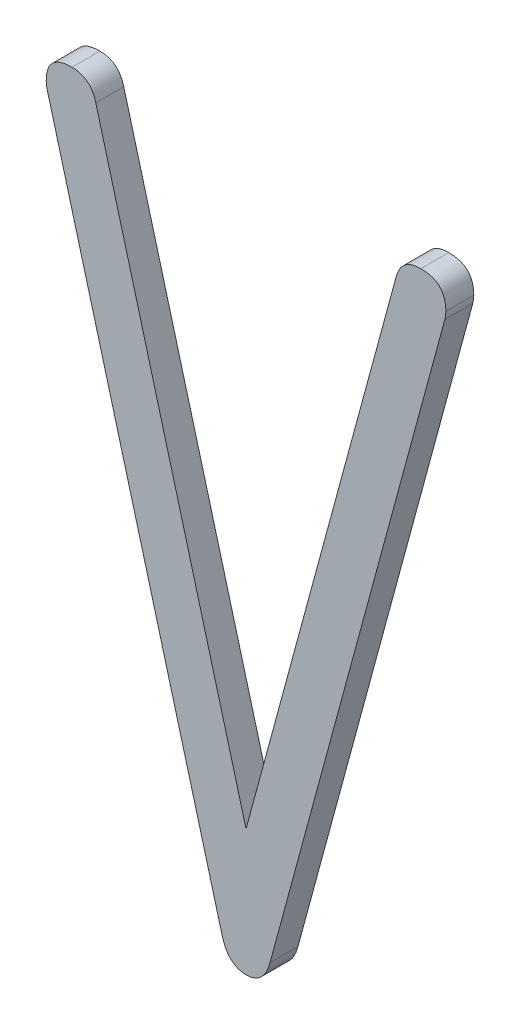
ISO-10303-21;
HEADER;
FILE_DESCRIPTION(('STEP AP214'),'2;1');
FILE_NAME('part.step','',(''),(''),'','','');
FILE_SCHEMA(('AUTOMOTIVE_DESIGN { 1 0 10303 214 1 1 1 1 }'));
ENDSEC;
DATA;
#1=APPLICATION_CONTEXT('core data for automotive mechanical design processes');
#2=APPLICATION_PROTOCOL_DEFINITION('international standard','automotive_design',2000,#1);
#3=PRODUCT_CONTEXT('',#1,'mechanical');
#4=PRODUCT('Part','Part','',(#3));
#5=PRODUCT_RELATED_PRODUCT_CATEGORY('part','',(#4));
#6=PRODUCT_DEFINITION_FORMATION('','',#4);
#7=PRODUCT_DEFINITION_CONTEXT('part definition',#1,'design');
#8=PRODUCT_DEFINITION('design','',#6,#7);
#9=PRODUCT_DEFINITION_SHAPE('','',#8);
#10=(LENGTH_UNIT() NAMED_UNIT(*) SI_UNIT(.MILLI.,.METRE.));
#11=(NAMED_UNIT(*) PLANE_ANGLE_UNIT() SI_UNIT($,.RADIAN.));
#12=(NAMED_UNIT(*) SI_UNIT($,.STERADIAN.) SOLID_ANGLE_UNIT());
#13=UNCERTAINTY_MEASURE_WITH_UNIT(LENGTH_MEASURE(1.E-05),#10,'distance_accuracy_value','');
#14=(GEOMETRIC_REPRESENTATION_CONTEXT(3) GLOBAL_UNCERTAINTY_ASSIGNED_CONTEXT((#13)) GLOBAL_UNIT_ASSIGNED_CONTEXT((#10,
#11,#12)) REPRESENTATION_CONTEXT('',''));
#15=CARTESIAN_POINT('',(0.,0.,0.));
#16=DIRECTION('',(0.,0.,1.));
#17=DIRECTION('',(1.,0.,0.));
#18=AXIS2_PLACEMENT_3D('',#15,#16,#17);
#19=CARTESIAN_POINT('',(0.,0.,1.6));
#20=DIRECTION('',(0.,0.,-1.));
#21=DIRECTION('',(-1.,0.,0.));
#22=AXIS2_PLACEMENT_3D('',#19,#20,#21);
#23=PLANE('',#22);
#24=CARTESIAN_POINT('',(10.4104312474728,-19.6608047798276,1.6));
#25=CARTESIAN_POINT('',(10.4104305589906,-19.6633076047553,1.6));
#26=CARTESIAN_POINT('',(10.4103281700194,-19.6658075865796,1.6));
#27=CARTESIAN_POINT('',(10.4099431319938,-19.6707934504474,1.6));
#28=CARTESIAN_POINT('',(10.4096605153006,-19.6732793349414,1.6));
#29=CARTESIAN_POINT('',(10.4086925987024,-19.6799121488722,1.6));
#30=CARTESIAN_POINT('',(10.4078641591437,-19.6840393939792,1.6));
#31=CARTESIAN_POINT('',(10.4068687474728,-19.6881172798276,1.6));
#32=B_SPLINE_CURVE_WITH_KNOTS('',3,(#24,#25,#26,#27,#28,#29,#30,#31),.UNSPECIFIED.,.F.,.F.,(4,2,
2,4),(0.,0.00750178916076674,0.0150022317003972,0.0276017619985489),.UNSPECIFIED.);
#33=CARTESIAN_POINT('',(10.4104312474728,-19.6608047798276,1.6));
#34=VERTEX_POINT('',#33);
#35=CARTESIAN_POINT('',(10.4068687474728,-19.6881172798276,1.6));
#36=VERTEX_POINT('',#35);
#37=EDGE_CURVE('E137',#34,#36,#32,.T.);
#38=ORIENTED_EDGE('',*,*,#37,.T.);
#39=DIRECTION('',(0.261841637735637,0.96511085205168,0.));
#40=VECTOR('',#39,1.);
#41=CARTESIAN_POINT('',(10.4068687474728,-19.6881172798276,1.6));
#42=LINE('',#41,#40);
#43=CARTESIAN_POINT('',(9.7815562474728,-21.9929297798276,1.6));
#44=VERTEX_POINT('',#43);
#45=EDGE_CURVE('E115',#44,#36,#42,.T.);
#46=ORIENTED_EDGE('',*,*,#45,.F.);
#47=CARTESIAN_POINT('',(9.7815562474728,-21.9929297798276,1.6));
#48=CARTESIAN_POINT('',(9.7601187474728,-22.0733047798276,1.6));
#49=CARTESIAN_POINT('',(9.6958062474728,-22.0733047798276,1.6));
#50=B_SPLINE_CURVE_WITH_KNOTS('',2,(#47,#48,#49),.UNSPECIFIED.,.F.,.F.,(3,3),(0.,1.),.UNSPECIFIED.);
#51=CARTESIAN_POINT('',(9.6958062474728,-22.0733047798276,1.6));
#52=VERTEX_POINT('',#51);
#53=EDGE_CURVE('E107',#44,#52,#50,.T.);
#54=ORIENTED_EDGE('',*,*,#53,.T.);
#55=CARTESIAN_POINT('',(9.6958062474728,-22.0733047798276,1.6));
#56=CARTESIAN_POINT('',(9.6314312474728,-22.0733047798276,1.6));
#57=CARTESIAN_POINT('',(9.6099937474728,-21.9929297798276,1.6));
#58=B_SPLINE_CURVE_WITH_KNOTS('',2,(#55,#56,#57),.UNSPECIFIED.,.F.,.F.,(3,3),(0.,1.),.UNSPECIFIED.);
#59=CARTESIAN_POINT('',(9.6099937474728,-21.9929297798276,1.6));
#60=VERTEX_POINT('',#59);
#61=EDGE_CURVE('E113',#52,#60,#58,.T.);
#62=ORIENTED_EDGE('',*,*,#61,.T.);
#63=DIRECTION('',(0.261841637735637,-0.96511085205168,0.));
#64=VECTOR('',#63,1.);
#65=CARTESIAN_POINT('',(9.6099937474728,-21.9929297798276,1.6));
#66=LINE('',#65,#64);
#67=CARTESIAN_POINT('',(8.9846812474728,-19.6881172798276,1.6));
#68=VERTEX_POINT('',#67);
#69=EDGE_CURVE('E123',#68,#60,#66,.T.);
#70=ORIENTED_EDGE('',*,*,#69,.F.);
#71=CARTESIAN_POINT('',(8.9846812474728,-19.6881172798276,1.6));
#72=CARTESIAN_POINT('',(8.98407767472837,-19.6856898823801,1.6));
#73=CARTESIAN_POINT('',(8.9835348476318,-19.683245485837,1.6));
#74=CARTESIAN_POINT('',(8.98259352797575,-19.6783289874013,1.6));
#75=CARTESIAN_POINT('',(8.9821950514327,-19.6758568824657,1.6));
#76=CARTESIAN_POINT('',(8.98135198276433,-19.6692086987752,1.6));
#77=CARTESIAN_POINT('',(8.98105928567588,-19.6650136732053,1.6));
#78=CARTESIAN_POINT('',(8.9810562474728,-19.6608047798298,1.6));
#79=B_SPLINE_CURVE_WITH_KNOTS('',3,(#71,#72,#73,#74,#75,#76,#77,#78),.UNSPECIFIED.,.F.,.F.,(4,2,
2,4),(0.,0.0075061529714251,0.0150131385333068,0.0276096797045703),.UNSPECIFIED.);
#80=CARTESIAN_POINT('',(8.9810562474728,-19.6608047798276,1.6));
#81=VERTEX_POINT('',#80);
#82=EDGE_CURVE('E23',#68,#81,#79,.T.);
#83=ORIENTED_EDGE('',*,*,#82,.T.);
#84=CARTESIAN_POINT('',(8.9810562474728,-19.6608047798276,1.6));
#85=CARTESIAN_POINT('',(8.9810562474728,-19.5733047798276,1.6));
#86=CARTESIAN_POINT('',(9.0730562474728,-19.5733047798276,1.6));
#87=B_SPLINE_CURVE_WITH_KNOTS('',2,(#84,#85,#86),.UNSPECIFIED.,.F.,.F.,(3,3),(0.,1.),.UNSPECIFIED.);
#88=CARTESIAN_POINT('',(9.0730562474728,-19.5733047798276,1.6));
#89=VERTEX_POINT('',#88);
#90=EDGE_CURVE('E159',#81,#89,#87,.T.);
#91=ORIENTED_EDGE('',*,*,#90,.T.);
#92=CARTESIAN_POINT('',(9.0730562474728,-19.5733047798276,1.6));
#93=CARTESIAN_POINT('',(9.1402437474728,-19.5733047798276,1.6));
#94=CARTESIAN_POINT('',(9.1584312474728,-19.6410547798276,1.6));
#95=B_SPLINE_CURVE_WITH_KNOTS('',2,(#92,#93,#94),.UNSPECIFIED.,.F.,.F.,(3,3),(0.,1.),.UNSPECIFIED.);
#96=CARTESIAN_POINT('',(9.1584312474728,-19.6410547798276,1.6));
#97=VERTEX_POINT('',#96);
#98=EDGE_CURVE('E158',#89,#97,#95,.T.);
#99=ORIENTED_EDGE('',*,*,#98,.T.);
#100=DIRECTION('',(-0.261820959999838,0.965116461834924,0.));
#101=VECTOR('',#100,1.);
#102=CARTESIAN_POINT('',(9.1584312474728,-19.6410547798276,1.6));
#103=LINE('',#102,#101);
#104=CARTESIAN_POINT('',(9.6957437474728,-21.6216797798276,1.6));
#105=VERTEX_POINT('',#104);
#106=EDGE_CURVE('E154',#105,#97,#103,.T.);
#107=ORIENTED_EDGE('',*,*,#106,.F.);
#108=DIRECTION('',(-0.261857023404155,-0.965106677675538,0.));
#109=VECTOR('',#108,1.);
#110=CARTESIAN_POINT('',(9.6957437474728,-21.6216797798276,1.6));
#111=LINE('',#110,#109);
#112=CARTESIAN_POINT('',(10.2331187474728,-19.6411172798276,1.6));
#113=VERTEX_POINT('',#112);
#114=EDGE_CURVE('E149',#113,#105,#111,.T.);
#115=ORIENTED_EDGE('',*,*,#114,.F.);
#116=CARTESIAN_POINT('',(10.2331187474728,-19.6411172798276,1.6));
#117=CARTESIAN_POINT('',(10.2518062474728,-19.5733047798276,1.6));
#118=CARTESIAN_POINT('',(10.3210562474728,-19.5733047798276,1.6));
#119=B_SPLINE_CURVE_WITH_KNOTS('',2,(#116,#117,#118),.UNSPECIFIED.,.F.,.F.,(3,3),(0.,1.),.UNSPECIFIED.);
#120=CARTESIAN_POINT('',(10.3210562474728,-19.5733047798276,1.6));
#121=VERTEX_POINT('',#120);
#122=EDGE_CURVE('E142',#113,#121,#119,.T.);
#123=ORIENTED_EDGE('',*,*,#122,.T.);
#124=CARTESIAN_POINT('',(10.3210562474728,-19.5733047798276,1.6));
#125=CARTESIAN_POINT('',(10.4104312474728,-19.5733047798276,1.6));
#126=CARTESIAN_POINT('',(10.4104312474728,-19.6608047798276,1.6));
#127=B_SPLINE_CURVE_WITH_KNOTS('',2,(#124,#125,#126),.UNSPECIFIED.,.F.,.F.,(3,3),(0.,1.),.UNSPECIFIED.);
#128=EDGE_CURVE('E138',#121,#34,#127,.T.);
#129=ORIENTED_EDGE('',*,*,#128,.T.);
#130=EDGE_LOOP('',(#38,#46,#54,#62,#70,#83,#91,#99,#107,#115,#123,#129));
#131=FACE_BOUND('',#130,.T.);
#132=ADVANCED_FACE('F17',(#131),#23,.T.);
#133=CARTESIAN_POINT('',(9.6958062474728,-22.0733047798276,1.7));
#134=CARTESIAN_POINT('',(9.6314312474728,-22.0733047798276,1.7));
#135=CARTESIAN_POINT('',(9.6099937474728,-21.9929297798276,1.7));
#136=CARTESIAN_POINT('',(9.6958062474728,-22.0733047798276,1.6));
#137=CARTESIAN_POINT('',(9.6314312474728,-22.0733047798276,1.6));
#138=CARTESIAN_POINT('',(9.6099937474728,-21.9929297798276,1.6));
#139=B_SPLINE_SURFACE_WITH_KNOTS('',1,2,((#133,#134,#135),(#136,#137,#138)),.UNSPECIFIED.,.F.,
.F.,.F.,(2,2),(3,3),(0.,1.),(0.,1.),.UNSPECIFIED.);
#140=DIRECTION('',(0.,0.,1.));
#141=VECTOR('',#140,1.);
#142=CARTESIAN_POINT('',(9.6958062474728,-22.0733047798276,1.65));
#143=LINE('',#142,#141);
#144=CARTESIAN_POINT('',(9.6958062474728,-22.0733047798276,1.7));
#145=VERTEX_POINT('',#144);
#146=EDGE_CURVE('E121',#52,#145,#143,.T.);
#147=CARTESIAN_POINT('',(9.6958062474728,-22.0733047798276,1.7));
#148=CARTESIAN_POINT('',(9.6314312474728,-22.0733047798276,1.7));
#149=CARTESIAN_POINT('',(9.6099937474728,-21.9929297798276,1.7));
#150=B_SPLINE_CURVE_WITH_KNOTS('',2,(#147,#148,#149),.UNSPECIFIED.,.F.,.F.,(3,3),(0.,1.),.UNSPECIFIED.);
#151=CARTESIAN_POINT('',(9.6099937474728,-21.9929297798276,1.7));
#152=VERTEX_POINT('',#151);
#153=EDGE_CURVE('E127',#145,#152,#150,.T.);
#154=DIRECTION('',(0.,0.,1.));
#155=VECTOR('',#154,1.);
#156=CARTESIAN_POINT('',(9.6099937474728,-21.9929297798276,1.7));
#157=LINE('',#156,#155);
#158=EDGE_CURVE('E122',#60,#152,#157,.T.);
#159=ORIENTED_EDGE('',*,*,#146,.T.);
#160=ORIENTED_EDGE('',*,*,#153,.T.);
#161=ORIENTED_EDGE('',*,*,#158,.F.);
#162=ORIENTED_EDGE('',*,*,#61,.F.);
#163=EDGE_LOOP('',(#159,#160,#161,#162));
#164=FACE_BOUND('',#163,.T.);
#165=ADVANCED_FACE('F119',(#164),#139,.F.);
#166=CARTESIAN_POINT('',(9.6099937474728,-21.9929297798276,1.7));
#167=DIRECTION('',(-0.96511085205168,-0.261841637735637,0.));
#168=DIRECTION('',(0.261841637735637,-0.96511085205168,0.));
#169=AXIS2_PLACEMENT_3D('',#166,#167,#168);
#170=PLANE('',#169);
#171=DIRECTION('',(-0.261841637735636,0.96511085205168,0.));
#172=VECTOR('',#171,1.);
#173=CARTESIAN_POINT('',(9.6099937474728,-21.9929297798276,1.7));
#174=LINE('',#173,#172);
#175=CARTESIAN_POINT('',(8.9846812474728,-19.6881172798276,1.7));
#176=VERTEX_POINT('',#175);
#177=EDGE_CURVE('E131',#152,#176,#174,.T.);
#178=ORIENTED_EDGE('',*,*,#177,.T.);
#179=DIRECTION('',(0.,0.,-1.));
#180=VECTOR('',#179,1.);
#181=CARTESIAN_POINT('',(8.9846812474728,-19.6881172798276,1.65));
#182=LINE('',#181,#180);
#183=EDGE_CURVE('E163',#176,#68,#182,.T.);
#184=ORIENTED_EDGE('',*,*,#183,.T.);
#185=ORIENTED_EDGE('',*,*,#69,.T.);
#186=ORIENTED_EDGE('',*,*,#158,.T.);
#187=EDGE_LOOP('',(#178,#184,#185,#186));
#188=FACE_BOUND('',#187,.T.);
#189=ADVANCED_FACE('F179',(#188),#170,.T.);
#190=CARTESIAN_POINT('',(8.9846812474728,-19.6881172798276,1.7));
#191=CARTESIAN_POINT('',(8.9810562474728,-19.6735547798276,1.7));
#192=CARTESIAN_POINT('',(8.9810562474728,-19.6608047798276,1.7));
#193=CARTESIAN_POINT('',(8.9846812474728,-19.6881172798276,1.6));
#194=CARTESIAN_POINT('',(8.9810562474728,-19.6735547798276,1.6));
#195=CARTESIAN_POINT('',(8.9810562474728,-19.6608047798276,1.6));
#196=B_SPLINE_SURFACE_WITH_KNOTS('',1,2,((#190,#191,#192),(#193,#194,#195)),.UNSPECIFIED.,.F.,
.F.,.F.,(2,2),(3,3),(0.,1.),(0.,1.),.UNSPECIFIED.);
#197=CARTESIAN_POINT('',(8.9846812474728,-19.6881172798276,1.7));
#198=CARTESIAN_POINT('',(8.98407767472837,-19.6856898823801,1.7));
#199=CARTESIAN_POINT('',(8.9835348476318,-19.683245485837,1.7));
#200=CARTESIAN_POINT('',(8.98259352797575,-19.6783289874013,1.7));
#201=CARTESIAN_POINT('',(8.9821950514327,-19.6758568824657,1.7));
#202=CARTESIAN_POINT('',(8.98135198276433,-19.6692086987752,1.7));
#203=CARTESIAN_POINT('',(8.98105928567588,-19.6650136732053,1.7));
#204=CARTESIAN_POINT('',(8.9810562474728,-19.6608047798298,1.7));
#205=B_SPLINE_CURVE_WITH_KNOTS('',3,(#197,#198,#199,#200,#201,#202,#203,#204),.UNSPECIFIED.,.F.,
.F.,(4,2,2,4),(0.,0.0075061529714251,0.0150131385333068,0.0276096797045703),.UNSPECIFIED.);
#206=CARTESIAN_POINT('',(8.9810562474728,-19.6608047798276,1.7));
#207=VERTEX_POINT('',#206);
#208=EDGE_CURVE('E202',#176,#207,#205,.T.);
#209=DIRECTION('',(0.,0.,-1.));
#210=VECTOR('',#209,1.);
#211=CARTESIAN_POINT('',(8.9810562474728,-19.6608047798276,1.65));
#212=LINE('',#211,#210);
#213=EDGE_CURVE('E160',#207,#81,#212,.T.);
#214=ORIENTED_EDGE('',*,*,#183,.F.);
#215=ORIENTED_EDGE('',*,*,#208,.T.);
#216=ORIENTED_EDGE('',*,*,#213,.T.);
#217=ORIENTED_EDGE('',*,*,#82,.F.);
#218=EDGE_LOOP('',(#214,#215,#216,#217));
#219=FACE_BOUND('',#218,.T.);
#220=ADVANCED_FACE('F316',(#219),#196,.F.);
#221=CARTESIAN_POINT('',(8.9810562474728,-19.6608047798276,1.7));
#222=CARTESIAN_POINT('',(8.9810562474728,-19.5733047798276,1.7));
#223=CARTESIAN_POINT('',(9.0730562474728,-19.5733047798276,1.7));
#224=CARTESIAN_POINT('',(8.9810562474728,-19.6608047798276,1.6));
#225=CARTESIAN_POINT('',(8.9810562474728,-19.5733047798276,1.6));
#226=CARTESIAN_POINT('',(9.0730562474728,-19.5733047798276,1.6));
#227=B_SPLINE_SURFACE_WITH_KNOTS('',1,2,((#221,#222,#223),(#224,#225,#226)),.UNSPECIFIED.,.F.,
.F.,.F.,(2,2),(3,3),(0.,1.),(0.,1.),.UNSPECIFIED.);
#228=CARTESIAN_POINT('',(8.9810562474728,-19.6608047798276,1.7));
#229=CARTESIAN_POINT('',(8.9810562474728,-19.5733047798276,1.7));
#230=CARTESIAN_POINT('',(9.0730562474728,-19.5733047798276,1.7));
#231=B_SPLINE_CURVE_WITH_KNOTS('',2,(#228,#229,#230),.UNSPECIFIED.,.F.,.F.,(3,3),(0.,1.),.UNSPECIFIED.);
#232=CARTESIAN_POINT('',(9.0730562474728,-19.5733047798276,1.7));
#233=VERTEX_POINT('',#232);
#234=EDGE_CURVE('E247',#207,#233,#231,.T.);
#235=DIRECTION('',(0.,0.,-1.));
#236=VECTOR('',#235,1.);
#237=CARTESIAN_POINT('',(9.0730562474728,-19.5733047798276,1.65));
#238=LINE('',#237,#236);
#239=EDGE_CURVE('E155',#233,#89,#238,.T.);
#240=ORIENTED_EDGE('',*,*,#213,.F.);
#241=ORIENTED_EDGE('',*,*,#234,.T.);
#242=ORIENTED_EDGE('',*,*,#239,.T.);
#243=ORIENTED_EDGE('',*,*,#90,.F.);
#244=EDGE_LOOP('',(#240,#241,#242,#243));
#245=FACE_BOUND('',#244,.T.);
#246=ADVANCED_FACE('F309',(#245),#227,.F.);
#247=CARTESIAN_POINT('',(9.0730562474728,-19.5733047798276,1.7));
#248=CARTESIAN_POINT('',(9.1402437474728,-19.5733047798276,1.7));
#249=CARTESIAN_POINT('',(9.1584312474728,-19.6410547798276,1.7));
#250=CARTESIAN_POINT('',(9.0730562474728,-19.5733047798276,1.6));
#251=CARTESIAN_POINT('',(9.1402437474728,-19.5733047798276,1.6));
#252=CARTESIAN_POINT('',(9.1584312474728,-19.6410547798276,1.6));
#253=B_SPLINE_SURFACE_WITH_KNOTS('',1,2,((#247,#248,#249),(#250,#251,#252)),.UNSPECIFIED.,.F.,
.F.,.F.,(2,2),(3,3),(0.,1.),(0.,1.),.UNSPECIFIED.);
#254=CARTESIAN_POINT('',(9.0730562474728,-19.5733047798276,1.7));
#255=CARTESIAN_POINT('',(9.1402437474728,-19.5733047798276,1.7));
#256=CARTESIAN_POINT('',(9.1584312474728,-19.6410547798276,1.7));
#257=B_SPLINE_CURVE_WITH_KNOTS('',2,(#254,#255,#256),.UNSPECIFIED.,.F.,.F.,(3,3),(0.,1.),.UNSPECIFIED.);
#258=CARTESIAN_POINT('',(9.1584312474728,-19.6410547798276,1.7));
#259=VERTEX_POINT('',#258);
#260=EDGE_CURVE('E251',#233,#259,#257,.T.);
#261=DIRECTION('',(0.,0.,1.));
#262=VECTOR('',#261,1.);
#263=CARTESIAN_POINT('',(9.1584312474728,-19.6410547798276,1.7));
#264=LINE('',#263,#262);
#265=EDGE_CURVE('E152',#97,#259,#264,.T.);
#266=ORIENTED_EDGE('',*,*,#239,.F.);
#267=ORIENTED_EDGE('',*,*,#260,.T.);
#268=ORIENTED_EDGE('',*,*,#265,.F.);
#269=ORIENTED_EDGE('',*,*,#98,.F.);
#270=EDGE_LOOP('',(#266,#267,#268,#269));
#271=FACE_BOUND('',#270,.T.);
#272=ADVANCED_FACE('F307',(#271),#253,.F.);
#273=CARTESIAN_POINT('',(9.1584312474728,-19.6410547798276,1.7));
#274=DIRECTION('',(0.965116461834924,0.261820959999838,0.));
#275=DIRECTION('',(-0.261820959999838,0.965116461834924,0.));
#276=AXIS2_PLACEMENT_3D('',#273,#274,#275);
#277=PLANE('',#276);
#278=DIRECTION('',(0.261820959999837,-0.965116461834925,0.));
#279=VECTOR('',#278,1.);
#280=CARTESIAN_POINT('',(9.1584312474728,-19.6410547798276,1.7));
#281=LINE('',#280,#279);
#282=CARTESIAN_POINT('',(9.6957437474728,-21.6216797798276,1.7));
#283=VERTEX_POINT('',#282);
#284=EDGE_CURVE('E272',#259,#283,#281,.T.);
#285=ORIENTED_EDGE('',*,*,#284,.T.);
#286=DIRECTION('',(0.,0.,1.));
#287=VECTOR('',#286,1.);
#288=CARTESIAN_POINT('',(9.6957437474728,-21.6216797798276,1.7));
#289=LINE('',#288,#287);
#290=EDGE_CURVE('E146',#105,#283,#289,.T.);
#291=ORIENTED_EDGE('',*,*,#290,.F.);
#292=ORIENTED_EDGE('',*,*,#106,.T.);
#293=ORIENTED_EDGE('',*,*,#265,.T.);
#294=EDGE_LOOP('',(#285,#291,#292,#293));
#295=FACE_BOUND('',#294,.T.);
#296=ADVANCED_FACE('F302',(#295),#277,.T.);
#297=CARTESIAN_POINT('',(9.6957437474728,-21.6216797798276,1.7));
#298=DIRECTION('',(-0.965106677675538,0.261857023404155,0.));
#299=DIRECTION('',(-0.261857023404155,-0.965106677675538,0.));
#300=AXIS2_PLACEMENT_3D('',#297,#298,#299);
#301=PLANE('',#300);
#302=DIRECTION('',(0.261857023404155,0.965106677675538,0.));
#303=VECTOR('',#302,1.);
#304=CARTESIAN_POINT('',(9.6957437474728,-21.6216797798276,1.7));
#305=LINE('',#304,#303);
#306=CARTESIAN_POINT('',(10.2331187474728,-19.6411172798276,1.7));
#307=VERTEX_POINT('',#306);
#308=EDGE_CURVE('E269',#283,#307,#305,.T.);
#309=ORIENTED_EDGE('',*,*,#308,.T.);
#310=DIRECTION('',(0.,0.,-1.));
#311=VECTOR('',#310,1.);
#312=CARTESIAN_POINT('',(10.2331187474728,-19.6411172798276,1.65));
#313=LINE('',#312,#311);
#314=EDGE_CURVE('E143',#307,#113,#313,.T.);
#315=ORIENTED_EDGE('',*,*,#314,.T.);
#316=ORIENTED_EDGE('',*,*,#114,.T.);
#317=ORIENTED_EDGE('',*,*,#290,.T.);
#318=EDGE_LOOP('',(#309,#315,#316,#317));
#319=FACE_BOUND('',#318,.T.);
#320=ADVANCED_FACE('F299',(#319),#301,.T.);
#321=CARTESIAN_POINT('',(10.2331187474728,-19.6411172798276,1.7));
#322=CARTESIAN_POINT('',(10.2518062474728,-19.5733047798276,1.7));
#323=CARTESIAN_POINT('',(10.3210562474728,-19.5733047798276,1.7));
#324=CARTESIAN_POINT('',(10.2331187474728,-19.6411172798276,1.6));
#325=CARTESIAN_POINT('',(10.2518062474728,-19.5733047798276,1.6));
#326=CARTESIAN_POINT('',(10.3210562474728,-19.5733047798276,1.6));
#327=B_SPLINE_SURFACE_WITH_KNOTS('',1,2,((#321,#322,#323),(#324,#325,#326)),.UNSPECIFIED.,.F.,
.F.,.F.,(2,2),(3,3),(0.,1.),(0.,1.),.UNSPECIFIED.);
#328=CARTESIAN_POINT('',(10.2331187474728,-19.6411172798276,1.7));
#329=CARTESIAN_POINT('',(10.2518062474728,-19.5733047798276,1.7));
#330=CARTESIAN_POINT('',(10.3210562474728,-19.5733047798276,1.7));
#331=B_SPLINE_CURVE_WITH_KNOTS('',2,(#328,#329,#330),.UNSPECIFIED.,.F.,.F.,(3,3),(0.,1.),.UNSPECIFIED.);
#332=CARTESIAN_POINT('',(10.3210562474728,-19.5733047798276,1.7));
#333=VERTEX_POINT('',#332);
#334=EDGE_CURVE('E255',#307,#333,#331,.T.);
#335=DIRECTION('',(0.,0.,-1.));
#336=VECTOR('',#335,1.);
#337=CARTESIAN_POINT('',(10.3210562474728,-19.5733047798276,1.65));
#338=LINE('',#337,#336);
#339=EDGE_CURVE('E139',#333,#121,#338,.T.);
#340=ORIENTED_EDGE('',*,*,#314,.F.);
#341=ORIENTED_EDGE('',*,*,#334,.T.);
#342=ORIENTED_EDGE('',*,*,#339,.T.);
#343=ORIENTED_EDGE('',*,*,#122,.F.);
#344=EDGE_LOOP('',(#340,#341,#342,#343));
#345=FACE_BOUND('',#344,.T.);
#346=ADVANCED_FACE('F322',(#345),#327,.F.);
#347=CARTESIAN_POINT('',(10.3210562474728,-19.5733047798276,1.7));
#348=CARTESIAN_POINT('',(10.4104312474728,-19.5733047798276,1.7));
#349=CARTESIAN_POINT('',(10.4104312474728,-19.6608047798276,1.7));
#350=CARTESIAN_POINT('',(10.3210562474728,-19.5733047798276,1.6));
#351=CARTESIAN_POINT('',(10.4104312474728,-19.5733047798276,1.6));
#352=CARTESIAN_POINT('',(10.4104312474728,-19.6608047798276,1.6));
#353=B_SPLINE_SURFACE_WITH_KNOTS('',1,2,((#347,#348,#349),(#350,#351,#352)),.UNSPECIFIED.,.F.,
.F.,.F.,(2,2),(3,3),(0.,1.),(0.,1.),.UNSPECIFIED.);
#354=CARTESIAN_POINT('',(10.3210562474728,-19.5733047798276,1.7));
#355=CARTESIAN_POINT('',(10.4104312474728,-19.5733047798276,1.7));
#356=CARTESIAN_POINT('',(10.4104312474728,-19.6608047798276,1.7));
#357=B_SPLINE_CURVE_WITH_KNOTS('',2,(#354,#355,#356),.UNSPECIFIED.,.F.,.F.,(3,3),(0.,1.),.UNSPECIFIED.);
#358=CARTESIAN_POINT('',(10.4104312474728,-19.6608047798276,1.7));
#359=VERTEX_POINT('',#358);
#360=EDGE_CURVE('E232',#333,#359,#357,.T.);
#361=DIRECTION('',(0.,0.,-1.));
#362=VECTOR('',#361,1.);
#363=CARTESIAN_POINT('',(10.4104312474728,-19.6608047798276,1.65));
#364=LINE('',#363,#362);
#365=EDGE_CURVE('E134',#359,#34,#364,.T.);
#366=ORIENTED_EDGE('',*,*,#339,.F.);
#367=ORIENTED_EDGE('',*,*,#360,.T.);
#368=ORIENTED_EDGE('',*,*,#365,.T.);
#369=ORIENTED_EDGE('',*,*,#128,.F.);
#370=EDGE_LOOP('',(#366,#367,#368,#369));
#371=FACE_BOUND('',#370,.T.);
#372=ADVANCED_FACE('F215',(#371),#353,.F.);
#373=CARTESIAN_POINT('',(10.4104312474728,-19.6608047798276,1.7));
#374=CARTESIAN_POINT('',(10.4104312474728,-19.6735547798276,1.7));
#375=CARTESIAN_POINT('',(10.4068687474728,-19.6881172798276,1.7));
#376=CARTESIAN_POINT('',(10.4104312474728,-19.6608047798276,1.6));
#377=CARTESIAN_POINT('',(10.4104312474728,-19.6735547798276,1.6));
#378=CARTESIAN_POINT('',(10.4068687474728,-19.6881172798276,1.6));
#379=B_SPLINE_SURFACE_WITH_KNOTS('',1,2,((#373,#374,#375),(#376,#377,#378)),.UNSPECIFIED.,.F.,
.F.,.F.,(2,2),(3,3),(0.,1.),(0.,1.),.UNSPECIFIED.);
#380=CARTESIAN_POINT('',(10.4104312474728,-19.6608047798276,1.7));
#381=CARTESIAN_POINT('',(10.4104305589906,-19.6633076047553,1.7));
#382=CARTESIAN_POINT('',(10.4103281700194,-19.6658075865796,1.7));
#383=CARTESIAN_POINT('',(10.4099431319938,-19.6707934504474,1.7));
#384=CARTESIAN_POINT('',(10.4096605153006,-19.6732793349414,1.7));
#385=CARTESIAN_POINT('',(10.4086925987024,-19.6799121488722,1.7));
#386=CARTESIAN_POINT('',(10.4078641591437,-19.6840393939792,1.7));
#387=CARTESIAN_POINT('',(10.4068687474728,-19.6881172798276,1.7));
#388=B_SPLINE_CURVE_WITH_KNOTS('',3,(#380,#381,#382,#383,#384,#385,#386,#387),.UNSPECIFIED.,.F.,
.F.,(4,2,2,4),(0.,0.00750178916076674,0.0150022317003972,0.0276017619985489),.UNSPECIFIED.);
#389=CARTESIAN_POINT('',(10.4068687474728,-19.6881172798276,1.7));
#390=VERTEX_POINT('',#389);
#391=EDGE_CURVE('E226',#359,#390,#388,.T.);
#392=DIRECTION('',(0.,0.,1.));
#393=VECTOR('',#392,1.);
#394=CARTESIAN_POINT('',(10.4068687474728,-19.6881172798276,1.7));
#395=LINE('',#394,#393);
#396=EDGE_CURVE('E125',#36,#390,#395,.T.);
#397=ORIENTED_EDGE('',*,*,#365,.F.);
#398=ORIENTED_EDGE('',*,*,#391,.T.);
#399=ORIENTED_EDGE('',*,*,#396,.F.);
#400=ORIENTED_EDGE('',*,*,#37,.F.);
#401=EDGE_LOOP('',(#397,#398,#399,#400));
#402=FACE_BOUND('',#401,.T.);
#403=ADVANCED_FACE('F208',(#402),#379,.F.);
#404=CARTESIAN_POINT('',(10.4068687474728,-19.6881172798276,1.7));
#405=DIRECTION('',(0.96511085205168,-0.261841637735637,0.));
#406=DIRECTION('',(0.261841637735637,0.96511085205168,0.));
#407=AXIS2_PLACEMENT_3D('',#404,#405,#406);
#408=PLANE('',#407);
#409=DIRECTION('',(-0.261841637735637,-0.96511085205168,0.));
#410=VECTOR('',#409,1.);
#411=CARTESIAN_POINT('',(10.4068687474728,-19.6881172798276,1.7));
#412=LINE('',#411,#410);
#413=CARTESIAN_POINT('',(9.7815562474728,-21.9929297798276,1.7));
#414=VERTEX_POINT('',#413);
#415=EDGE_CURVE('E34',#390,#414,#412,.T.);
#416=ORIENTED_EDGE('',*,*,#415,.T.);
#417=DIRECTION('',(0.,0.,-1.));
#418=VECTOR('',#417,1.);
#419=CARTESIAN_POINT('',(9.7815562474728,-21.9929297798276,1.65));
#420=LINE('',#419,#418);
#421=EDGE_CURVE('E42',#414,#44,#420,.T.);
#422=ORIENTED_EDGE('',*,*,#421,.T.);
#423=ORIENTED_EDGE('',*,*,#45,.T.);
#424=ORIENTED_EDGE('',*,*,#396,.T.);
#425=EDGE_LOOP('',(#416,#422,#423,#424));
#426=FACE_BOUND('',#425,.T.);
#427=ADVANCED_FACE('F214',(#426),#408,.T.);
#428=CARTESIAN_POINT('',(9.7815562474728,-21.9929297798276,1.7));
#429=CARTESIAN_POINT('',(9.7601187474728,-22.0733047798276,1.7));
#430=CARTESIAN_POINT('',(9.6958062474728,-22.0733047798276,1.7));
#431=CARTESIAN_POINT('',(9.7815562474728,-21.9929297798276,1.6));
#432=CARTESIAN_POINT('',(9.7601187474728,-22.0733047798276,1.6));
#433=CARTESIAN_POINT('',(9.6958062474728,-22.0733047798276,1.6));
#434=B_SPLINE_SURFACE_WITH_KNOTS('',1,2,((#428,#429,#430),(#431,#432,#433)),.UNSPECIFIED.,.F.,
.F.,.F.,(2,2),(3,3),(0.,1.),(0.,1.),.UNSPECIFIED.);
#435=CARTESIAN_POINT('',(9.7815562474728,-21.9929297798276,1.7));
#436=CARTESIAN_POINT('',(9.7601187474728,-22.0733047798276,1.7));
#437=CARTESIAN_POINT('',(9.6958062474728,-22.0733047798276,1.7));
#438=B_SPLINE_CURVE_WITH_KNOTS('',2,(#435,#436,#437),.UNSPECIFIED.,.F.,.F.,(3,3),(0.,1.),.UNSPECIFIED.);
#439=EDGE_CURVE('E11',#414,#145,#438,.T.);
#440=ORIENTED_EDGE('',*,*,#421,.F.);
#441=ORIENTED_EDGE('',*,*,#439,.T.);
#442=ORIENTED_EDGE('',*,*,#146,.F.);
#443=ORIENTED_EDGE('',*,*,#53,.F.);
#444=EDGE_LOOP('',(#440,#441,#442,#443));
#445=FACE_BOUND('',#444,.T.);
#446=ADVANCED_FACE('F19',(#445),#434,.F.);
#447=CARTESIAN_POINT('',(0.,0.,1.7));
#448=DIRECTION('',(0.,0.,-1.));
#449=DIRECTION('',(-1.,0.,0.));
#450=AXIS2_PLACEMENT_3D('',#447,#448,#449);
#451=PLANE('',#450);
#452=ORIENTED_EDGE('',*,*,#415,.F.);
#453=ORIENTED_EDGE('',*,*,#391,.F.);
#454=ORIENTED_EDGE('',*,*,#360,.F.);
#455=ORIENTED_EDGE('',*,*,#334,.F.);
#456=ORIENTED_EDGE('',*,*,#308,.F.);
#457=ORIENTED_EDGE('',*,*,#284,.F.);
#458=ORIENTED_EDGE('',*,*,#260,.F.);
#459=ORIENTED_EDGE('',*,*,#234,.F.);
#460=ORIENTED_EDGE('',*,*,#208,.F.);
#461=ORIENTED_EDGE('',*,*,#177,.F.);
#462=ORIENTED_EDGE('',*,*,#153,.F.);
#463=ORIENTED_EDGE('',*,*,#439,.F.);
#464=EDGE_LOOP('',(#452,#453,#454,#455,#456,#457,#458,#459,#460,#461,#462,#463));
#465=FACE_BOUND('',#464,.T.);
#466=ADVANCED_FACE('F234',(#465),#451,.F.);
#467=CLOSED_SHELL('',(#132,#165,#189,#220,#246,#272,#296,#320,#346,#372,#403,#427,#446,#466));
#468=MANIFOLD_SOLID_BREP('B1',#467);
#469=ADVANCED_BREP_SHAPE_REPRESENTATION('',(#18,#468),#14);
#470=SHAPE_DEFINITION_REPRESENTATION(#9,#469);
ENDSEC;
END-ISO-10303-21;
